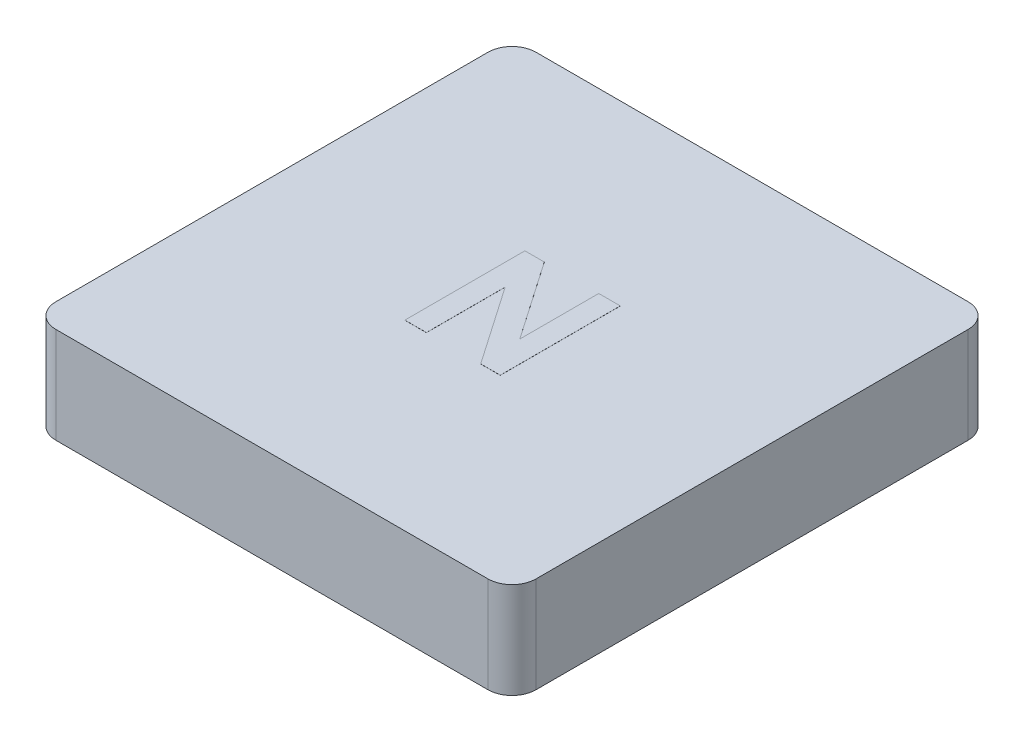
ISO-10303-21;
HEADER;
FILE_DESCRIPTION(('STEP AP214'),'2;1');
FILE_NAME('part.step','',(''),(''),'','','');
FILE_SCHEMA(('AUTOMOTIVE_DESIGN { 1 0 10303 214 1 1 1 1 }'));
ENDSEC;
DATA;
#1=APPLICATION_CONTEXT('core data for automotive mechanical design processes');
#2=APPLICATION_PROTOCOL_DEFINITION('international standard','automotive_design',2000,#1);
#3=PRODUCT_CONTEXT('',#1,'mechanical');
#4=PRODUCT('Part','Part','',(#3));
#5=PRODUCT_RELATED_PRODUCT_CATEGORY('part','',(#4));
#6=PRODUCT_DEFINITION_FORMATION('','',#4);
#7=PRODUCT_DEFINITION_CONTEXT('part definition',#1,'design');
#8=PRODUCT_DEFINITION('design','',#6,#7);
#9=PRODUCT_DEFINITION_SHAPE('','',#8);
#10=(LENGTH_UNIT() NAMED_UNIT(*) SI_UNIT(.MILLI.,.METRE.));
#11=(NAMED_UNIT(*) PLANE_ANGLE_UNIT() SI_UNIT($,.RADIAN.));
#12=(NAMED_UNIT(*) SI_UNIT($,.STERADIAN.) SOLID_ANGLE_UNIT());
#13=UNCERTAINTY_MEASURE_WITH_UNIT(LENGTH_MEASURE(1.E-05),#10,'distance_accuracy_value','');
#14=(GEOMETRIC_REPRESENTATION_CONTEXT(3) GLOBAL_UNCERTAINTY_ASSIGNED_CONTEXT((#13)) GLOBAL_UNIT_ASSIGNED_CONTEXT((#10,
#11,#12)) REPRESENTATION_CONTEXT('',''));
#15=CARTESIAN_POINT('',(0.,0.,0.));
#16=DIRECTION('',(0.,0.,1.));
#17=DIRECTION('',(1.,0.,0.));
#18=AXIS2_PLACEMENT_3D('',#15,#16,#17);
#19=CARTESIAN_POINT('',(0.,2.54,-12.7));
#20=DIRECTION('',(1.,0.,0.));
#21=DIRECTION('',(0.,0.,-1.));
#22=AXIS2_PLACEMENT_3D('',#19,#20,#21);
#23=PLANE('',#22);
#24=DIRECTION('',(0.,0.,1.));
#25=VECTOR('',#24,1.);
#26=CARTESIAN_POINT('',(0.,2.54,-12.7));
#27=LINE('',#26,#25);
#28=CARTESIAN_POINT('',(0.,2.54,-12.065));
#29=VERTEX_POINT('',#28);
#30=CARTESIAN_POINT('',(0.,2.54,-0.635));
#31=VERTEX_POINT('',#30);
#32=EDGE_CURVE('E308',#29,#31,#27,.T.);
#33=ORIENTED_EDGE('',*,*,#32,.F.);
#34=DIRECTION('',(0.,-1.,0.));
#35=VECTOR('',#34,1.);
#36=CARTESIAN_POINT('',(0.,2.54,-12.065));
#37=LINE('',#36,#35);
#38=CARTESIAN_POINT('',(0.,0.,-12.065));
#39=VERTEX_POINT('',#38);
#40=EDGE_CURVE('E333',#29,#39,#37,.T.);
#41=ORIENTED_EDGE('',*,*,#40,.T.);
#42=DIRECTION('',(0.,0.,1.));
#43=VECTOR('',#42,1.);
#44=CARTESIAN_POINT('',(0.,0.,-12.7));
#45=LINE('',#44,#43);
#46=CARTESIAN_POINT('',(0.,0.,-0.635));
#47=VERTEX_POINT('',#46);
#48=EDGE_CURVE('E288',#39,#47,#45,.T.);
#49=ORIENTED_EDGE('',*,*,#48,.T.);
#50=DIRECTION('',(0.,-1.,0.));
#51=VECTOR('',#50,1.);
#52=CARTESIAN_POINT('',(0.,2.54,-0.635));
#53=LINE('',#52,#51);
#54=EDGE_CURVE('E321',#47,#31,#53,.F.);
#55=ORIENTED_EDGE('',*,*,#54,.T.);
#56=EDGE_LOOP('',(#33,#41,#49,#55));
#57=FACE_BOUND('',#56,.T.);
#58=ADVANCED_FACE('F33',(#57),#23,.F.);
#59=CARTESIAN_POINT('',(0.,2.54,0.));
#60=DIRECTION('',(0.,0.,-1.));
#61=DIRECTION('',(-1.,0.,0.));
#62=AXIS2_PLACEMENT_3D('',#59,#60,#61);
#63=PLANE('',#62);
#64=DIRECTION('',(1.,0.,0.));
#65=VECTOR('',#64,1.);
#66=CARTESIAN_POINT('',(0.,0.,0.));
#67=LINE('',#66,#65);
#68=CARTESIAN_POINT('',(0.635,0.,0.));
#69=VERTEX_POINT('',#68);
#70=CARTESIAN_POINT('',(12.065,0.,0.));
#71=VERTEX_POINT('',#70);
#72=EDGE_CURVE('E324',#69,#71,#67,.T.);
#73=ORIENTED_EDGE('',*,*,#72,.T.);
#74=DIRECTION('',(0.,-1.,0.));
#75=VECTOR('',#74,1.);
#76=CARTESIAN_POINT('',(12.065,2.54,0.));
#77=LINE('',#76,#75);
#78=CARTESIAN_POINT('',(12.065,2.54,0.));
#79=VERTEX_POINT('',#78);
#80=EDGE_CURVE('E41',#71,#79,#77,.F.);
#81=ORIENTED_EDGE('',*,*,#80,.T.);
#82=DIRECTION('',(1.,0.,0.));
#83=VECTOR('',#82,1.);
#84=CARTESIAN_POINT('',(0.,2.54,0.));
#85=LINE('',#84,#83);
#86=CARTESIAN_POINT('',(0.635,2.54,0.));
#87=VERTEX_POINT('',#86);
#88=EDGE_CURVE('E311',#87,#79,#85,.T.);
#89=ORIENTED_EDGE('',*,*,#88,.F.);
#90=DIRECTION('',(0.,-1.,0.));
#91=VECTOR('',#90,1.);
#92=CARTESIAN_POINT('',(0.635,2.54,0.));
#93=LINE('',#92,#91);
#94=EDGE_CURVE('E362',#87,#69,#93,.T.);
#95=ORIENTED_EDGE('',*,*,#94,.T.);
#96=EDGE_LOOP('',(#73,#81,#89,#95));
#97=FACE_BOUND('',#96,.T.);
#98=ADVANCED_FACE('F367',(#97),#63,.F.);
#99=CARTESIAN_POINT('',(12.7,2.54,0.));
#100=DIRECTION('',(-1.,0.,0.));
#101=DIRECTION('',(0.,0.,1.));
#102=AXIS2_PLACEMENT_3D('',#99,#100,#101);
#103=PLANE('',#102);
#104=DIRECTION('',(0.,0.,-1.));
#105=VECTOR('',#104,1.);
#106=CARTESIAN_POINT('',(12.7,0.,0.));
#107=LINE('',#106,#105);
#108=CARTESIAN_POINT('',(12.7,0.,-0.635));
#109=VERTEX_POINT('',#108);
#110=CARTESIAN_POINT('',(12.7,0.,-12.065));
#111=VERTEX_POINT('',#110);
#112=EDGE_CURVE('E327',#109,#111,#107,.T.);
#113=ORIENTED_EDGE('',*,*,#112,.T.);
#114=DIRECTION('',(0.,-1.,0.));
#115=VECTOR('',#114,1.);
#116=CARTESIAN_POINT('',(12.7,2.54,-12.065));
#117=LINE('',#116,#115);
#118=CARTESIAN_POINT('',(12.7,2.54,-12.065));
#119=VERTEX_POINT('',#118);
#120=EDGE_CURVE('E360',#111,#119,#117,.F.);
#121=ORIENTED_EDGE('',*,*,#120,.T.);
#122=DIRECTION('',(0.,0.,-1.));
#123=VECTOR('',#122,1.);
#124=CARTESIAN_POINT('',(12.7,2.54,0.));
#125=LINE('',#124,#123);
#126=CARTESIAN_POINT('',(12.7,2.54,-0.635));
#127=VERTEX_POINT('',#126);
#128=EDGE_CURVE('E315',#127,#119,#125,.T.);
#129=ORIENTED_EDGE('',*,*,#128,.F.);
#130=DIRECTION('',(0.,-1.,0.));
#131=VECTOR('',#130,1.);
#132=CARTESIAN_POINT('',(12.7,2.54,-0.635));
#133=LINE('',#132,#131);
#134=EDGE_CURVE('E357',#127,#109,#133,.T.);
#135=ORIENTED_EDGE('',*,*,#134,.T.);
#136=EDGE_LOOP('',(#113,#121,#129,#135));
#137=FACE_BOUND('',#136,.T.);
#138=ADVANCED_FACE('F380',(#137),#103,.F.);
#139=CARTESIAN_POINT('',(12.7,2.54,-12.7));
#140=DIRECTION('',(0.,0.,1.));
#141=DIRECTION('',(1.,0.,0.));
#142=AXIS2_PLACEMENT_3D('',#139,#140,#141);
#143=PLANE('',#142);
#144=DIRECTION('',(-1.,0.,0.));
#145=VECTOR('',#144,1.);
#146=CARTESIAN_POINT('',(12.7,0.,-12.7));
#147=LINE('',#146,#145);
#148=CARTESIAN_POINT('',(12.065,0.,-12.7));
#149=VERTEX_POINT('',#148);
#150=CARTESIAN_POINT('',(0.634999999999995,0.,-12.7));
#151=VERTEX_POINT('',#150);
#152=EDGE_CURVE('E312',#149,#151,#147,.T.);
#153=ORIENTED_EDGE('',*,*,#152,.T.);
#154=DIRECTION('',(0.,-1.,0.));
#155=VECTOR('',#154,1.);
#156=CARTESIAN_POINT('',(0.634999999999995,2.54,-12.7));
#157=LINE('',#156,#155);
#158=CARTESIAN_POINT('',(0.634999999999995,2.54,-12.7));
#159=VERTEX_POINT('',#158);
#160=EDGE_CURVE('E347',#151,#159,#157,.F.);
#161=ORIENTED_EDGE('',*,*,#160,.T.);
#162=DIRECTION('',(-1.,0.,0.));
#163=VECTOR('',#162,1.);
#164=CARTESIAN_POINT('',(12.7,2.54,-12.7));
#165=LINE('',#164,#163);
#166=CARTESIAN_POINT('',(12.065,2.54,-12.7));
#167=VERTEX_POINT('',#166);
#168=EDGE_CURVE('E318',#167,#159,#165,.T.);
#169=ORIENTED_EDGE('',*,*,#168,.F.);
#170=DIRECTION('',(0.,-1.,0.));
#171=VECTOR('',#170,1.);
#172=CARTESIAN_POINT('',(12.065,2.54,-12.7));
#173=LINE('',#172,#171);
#174=EDGE_CURVE('E344',#167,#149,#173,.T.);
#175=ORIENTED_EDGE('',*,*,#174,.T.);
#176=EDGE_LOOP('',(#153,#161,#169,#175));
#177=FACE_BOUND('',#176,.T.);
#178=ADVANCED_FACE('F392',(#177),#143,.F.);
#179=CARTESIAN_POINT('',(0.,2.54,0.));
#180=DIRECTION('',(0.,1.,0.));
#181=DIRECTION('',(0.,0.,1.));
#182=AXIS2_PLACEMENT_3D('',#179,#180,#181);
#183=PLANE('',#182);
#184=DIRECTION('',(0.,0.,-1.));
#185=VECTOR('',#184,1.);
#186=CARTESIAN_POINT('',(5.03994615384615,2.54,-4.826));
#187=LINE('',#186,#185);
#188=CARTESIAN_POINT('',(5.03994615384615,2.54,-4.826));
#189=VERTEX_POINT('',#188);
#190=CARTESIAN_POINT('',(5.03994615384615,2.54,-8.001));
#191=VERTEX_POINT('',#190);
#192=EDGE_CURVE('E230',#189,#191,#187,.T.);
#193=ORIENTED_EDGE('',*,*,#192,.T.);
#194=DIRECTION('',(1.,0.,0.));
#195=VECTOR('',#194,1.);
#196=CARTESIAN_POINT('',(5.03994615384615,2.54,-8.001));
#197=LINE('',#196,#195);
#198=CARTESIAN_POINT('',(5.55321237980769,2.54,-8.001));
#199=VERTEX_POINT('',#198);
#200=EDGE_CURVE('E187',#191,#199,#197,.T.);
#201=ORIENTED_EDGE('',*,*,#200,.T.);
#202=DIRECTION('',(0.567645105726481,0.,0.823273365258935));
#203=VECTOR('',#202,1.);
#204=CARTESIAN_POINT('',(5.55321237980769,2.54,-8.001));
#205=LINE('',#204,#203);
#206=CARTESIAN_POINT('',(6.9937923076923,2.54,-5.91168209134615));
#207=VERTEX_POINT('',#206);
#208=EDGE_CURVE('E233',#199,#207,#205,.T.);
#209=ORIENTED_EDGE('',*,*,#208,.T.);
#210=DIRECTION('',(0.,0.,-1.));
#211=VECTOR('',#210,1.);
#212=CARTESIAN_POINT('',(6.9937923076923,2.54,-5.91168209134615));
#213=LINE('',#212,#211);
#214=CARTESIAN_POINT('',(6.9937923076923,2.54,-8.001));
#215=VERTEX_POINT('',#214);
#216=EDGE_CURVE('E235',#207,#215,#213,.T.);
#217=ORIENTED_EDGE('',*,*,#216,.T.);
#218=DIRECTION('',(1.,0.,0.));
#219=VECTOR('',#218,1.);
#220=CARTESIAN_POINT('',(6.9937923076923,2.54,-8.001));
#221=LINE('',#220,#219);
#222=CARTESIAN_POINT('',(7.5636641025641,2.54,-8.001));
#223=VERTEX_POINT('',#222);
#224=EDGE_CURVE('E237',#215,#223,#221,.T.);
#225=ORIENTED_EDGE('',*,*,#224,.T.);
#226=DIRECTION('',(0.,0.,1.));
#227=VECTOR('',#226,1.);
#228=CARTESIAN_POINT('',(7.5636641025641,2.54,-8.001));
#229=LINE('',#228,#227);
#230=CARTESIAN_POINT('',(7.5636641025641,2.54,-4.826));
#231=VERTEX_POINT('',#230);
#232=EDGE_CURVE('E239',#223,#231,#229,.T.);
#233=ORIENTED_EDGE('',*,*,#232,.T.);
#234=DIRECTION('',(-1.,0.,0.));
#235=VECTOR('',#234,1.);
#236=CARTESIAN_POINT('',(7.5636641025641,2.54,-4.826));
#237=LINE('',#236,#235);
#238=CARTESIAN_POINT('',(7.04658177083333,2.54,-4.826));
#239=VERTEX_POINT('',#238);
#240=EDGE_CURVE('E241',#231,#239,#237,.T.);
#241=ORIENTED_EDGE('',*,*,#240,.T.);
#242=DIRECTION('',(-0.567797563527585,0.,-0.823168225122993));
#243=VECTOR('',#242,1.);
#244=CARTESIAN_POINT('',(7.04658177083333,2.54,-4.826));
#245=LINE('',#244,#243);
#246=CARTESIAN_POINT('',(5.60981794871794,2.54,-6.90895773237179));
#247=VERTEX_POINT('',#246);
#248=EDGE_CURVE('E243',#239,#247,#245,.T.);
#249=ORIENTED_EDGE('',*,*,#248,.T.);
#250=DIRECTION('',(0.,0.,1.));
#251=VECTOR('',#250,1.);
#252=CARTESIAN_POINT('',(5.60981794871794,2.54,-6.90895773237179));
#253=LINE('',#252,#251);
#254=CARTESIAN_POINT('',(5.60981794871794,2.54,-4.826));
#255=VERTEX_POINT('',#254);
#256=EDGE_CURVE('E53',#247,#255,#253,.T.);
#257=ORIENTED_EDGE('',*,*,#256,.T.);
#258=DIRECTION('',(-1.,0.,0.));
#259=VECTOR('',#258,1.);
#260=CARTESIAN_POINT('',(5.60981794871794,2.54,-4.826));
#261=LINE('',#260,#259);
#262=EDGE_CURVE('E48',#255,#189,#261,.T.);
#263=ORIENTED_EDGE('',*,*,#262,.T.);
#264=EDGE_LOOP('',(#193,#201,#209,#217,#225,#233,#241,#249,#257,#263));
#265=FACE_BOUND('',#264,.T.);
#266=ORIENTED_EDGE('',*,*,#168,.T.);
#267=CARTESIAN_POINT('',(0.634999999999995,2.54,-12.065));
#268=DIRECTION('',(0.,1.,0.));
#269=DIRECTION('',(0.,0.,1.));
#270=AXIS2_PLACEMENT_3D('',#267,#268,#269);
#271=CIRCLE('',#270,0.635);
#272=EDGE_CURVE('E355',#159,#29,#271,.T.);
#273=ORIENTED_EDGE('',*,*,#272,.T.);
#274=ORIENTED_EDGE('',*,*,#32,.T.);
#275=CARTESIAN_POINT('',(0.635,2.54,-0.635));
#276=DIRECTION('',(0.,1.,0.));
#277=DIRECTION('',(0.,0.,1.));
#278=AXIS2_PLACEMENT_3D('',#275,#276,#277);
#279=CIRCLE('',#278,0.635);
#280=EDGE_CURVE('E349',#31,#87,#279,.T.);
#281=ORIENTED_EDGE('',*,*,#280,.T.);
#282=ORIENTED_EDGE('',*,*,#88,.T.);
#283=CARTESIAN_POINT('',(12.065,2.54,-0.635));
#284=DIRECTION('',(0.,1.,0.));
#285=DIRECTION('',(0.,0.,1.));
#286=AXIS2_PLACEMENT_3D('',#283,#284,#285);
#287=CIRCLE('',#286,0.635);
#288=EDGE_CURVE('E351',#79,#127,#287,.T.);
#289=ORIENTED_EDGE('',*,*,#288,.T.);
#290=ORIENTED_EDGE('',*,*,#128,.T.);
#291=CARTESIAN_POINT('',(12.065,2.54,-12.065));
#292=DIRECTION('',(0.,1.,0.));
#293=DIRECTION('',(0.,0.,1.));
#294=AXIS2_PLACEMENT_3D('',#291,#292,#293);
#295=CIRCLE('',#294,0.635);
#296=EDGE_CURVE('E353',#119,#167,#295,.T.);
#297=ORIENTED_EDGE('',*,*,#296,.T.);
#298=EDGE_LOOP('',(#266,#273,#274,#281,#282,#289,#290,#297));
#299=FACE_BOUND('',#298,.T.);
#300=ADVANCED_FACE('F373',(#265,#299),#183,.T.);
#301=CARTESIAN_POINT('',(0.,0.,0.));
#302=DIRECTION('',(0.,1.,0.));
#303=DIRECTION('',(0.,0.,1.));
#304=AXIS2_PLACEMENT_3D('',#301,#302,#303);
#305=PLANE('',#304);
#306=DIRECTION('',(-1.,0.,0.));
#307=VECTOR('',#306,1.);
#308=CARTESIAN_POINT('',(12.7,0.,-12.065));
#309=LINE('',#308,#307);
#310=CARTESIAN_POINT('',(12.065,0.,-12.065));
#311=VERTEX_POINT('',#310);
#312=CARTESIAN_POINT('',(0.634999999999995,0.,-12.065));
#313=VERTEX_POINT('',#312);
#314=EDGE_CURVE('E276',#311,#313,#309,.T.);
#315=ORIENTED_EDGE('',*,*,#314,.T.);
#316=DIRECTION('',(0.,0.,1.));
#317=VECTOR('',#316,1.);
#318=CARTESIAN_POINT('',(0.634999999999995,0.,-12.7));
#319=LINE('',#318,#317);
#320=CARTESIAN_POINT('',(0.635,0.,-0.635));
#321=VERTEX_POINT('',#320);
#322=EDGE_CURVE('E271',#313,#321,#319,.T.);
#323=ORIENTED_EDGE('',*,*,#322,.T.);
#324=DIRECTION('',(1.,0.,0.));
#325=VECTOR('',#324,1.);
#326=CARTESIAN_POINT('',(0.,0.,-0.635));
#327=LINE('',#326,#325);
#328=CARTESIAN_POINT('',(12.065,0.,-0.635));
#329=VERTEX_POINT('',#328);
#330=EDGE_CURVE('E300',#321,#329,#327,.T.);
#331=ORIENTED_EDGE('',*,*,#330,.T.);
#332=DIRECTION('',(0.,0.,-1.));
#333=VECTOR('',#332,1.);
#334=CARTESIAN_POINT('',(12.065,0.,0.));
#335=LINE('',#334,#333);
#336=EDGE_CURVE('E303',#329,#311,#335,.T.);
#337=ORIENTED_EDGE('',*,*,#336,.T.);
#338=EDGE_LOOP('',(#315,#323,#331,#337));
#339=FACE_BOUND('',#338,.T.);
#340=ORIENTED_EDGE('',*,*,#48,.F.);
#341=CARTESIAN_POINT('',(0.634999999999995,0.,-12.065));
#342=DIRECTION('',(0.,1.,0.));
#343=DIRECTION('',(0.,0.,1.));
#344=AXIS2_PLACEMENT_3D('',#341,#342,#343);
#345=CIRCLE('',#344,0.635);
#346=EDGE_CURVE('E342',#39,#151,#345,.F.);
#347=ORIENTED_EDGE('',*,*,#346,.T.);
#348=ORIENTED_EDGE('',*,*,#152,.F.);
#349=CARTESIAN_POINT('',(12.065,0.,-12.065));
#350=DIRECTION('',(0.,1.,0.));
#351=DIRECTION('',(0.,0.,1.));
#352=AXIS2_PLACEMENT_3D('',#349,#350,#351);
#353=CIRCLE('',#352,0.635);
#354=EDGE_CURVE('E340',#149,#111,#353,.F.);
#355=ORIENTED_EDGE('',*,*,#354,.T.);
#356=ORIENTED_EDGE('',*,*,#112,.F.);
#357=CARTESIAN_POINT('',(12.065,0.,-0.635));
#358=DIRECTION('',(0.,1.,0.));
#359=DIRECTION('',(0.,0.,1.));
#360=AXIS2_PLACEMENT_3D('',#357,#358,#359);
#361=CIRCLE('',#360,0.635);
#362=EDGE_CURVE('E338',#109,#71,#361,.F.);
#363=ORIENTED_EDGE('',*,*,#362,.T.);
#364=ORIENTED_EDGE('',*,*,#72,.F.);
#365=CARTESIAN_POINT('',(0.635,0.,-0.635));
#366=DIRECTION('',(0.,1.,0.));
#367=DIRECTION('',(0.,0.,1.));
#368=AXIS2_PLACEMENT_3D('',#365,#366,#367);
#369=CIRCLE('',#368,0.635);
#370=EDGE_CURVE('E336',#69,#47,#369,.F.);
#371=ORIENTED_EDGE('',*,*,#370,.T.);
#372=EDGE_LOOP('',(#340,#347,#348,#355,#356,#363,#364,#371));
#373=FACE_BOUND('',#372,.T.);
#374=ADVANCED_FACE('F384',(#339,#373),#305,.F.);
#375=CARTESIAN_POINT('',(0.634999999999995,2.54,-12.065));
#376=DIRECTION('',(0.,-1.,0.));
#377=DIRECTION('',(0.,0.,-1.));
#378=AXIS2_PLACEMENT_3D('',#375,#376,#377);
#379=CYLINDRICAL_SURFACE('',#378,0.635);
#380=ORIENTED_EDGE('',*,*,#272,.F.);
#381=ORIENTED_EDGE('',*,*,#160,.F.);
#382=ORIENTED_EDGE('',*,*,#346,.F.);
#383=ORIENTED_EDGE('',*,*,#40,.F.);
#384=EDGE_LOOP('',(#380,#381,#382,#383));
#385=FACE_BOUND('',#384,.T.);
#386=ADVANCED_FACE('F398',(#385),#379,.T.);
#387=CARTESIAN_POINT('',(12.065,2.54,-12.065));
#388=DIRECTION('',(0.,-1.,0.));
#389=DIRECTION('',(0.,0.,-1.));
#390=AXIS2_PLACEMENT_3D('',#387,#388,#389);
#391=CYLINDRICAL_SURFACE('',#390,0.635);
#392=ORIENTED_EDGE('',*,*,#296,.F.);
#393=ORIENTED_EDGE('',*,*,#120,.F.);
#394=ORIENTED_EDGE('',*,*,#354,.F.);
#395=ORIENTED_EDGE('',*,*,#174,.F.);
#396=EDGE_LOOP('',(#392,#393,#394,#395));
#397=FACE_BOUND('',#396,.T.);
#398=ADVANCED_FACE('F389',(#397),#391,.T.);
#399=CARTESIAN_POINT('',(12.065,2.54,-0.635));
#400=DIRECTION('',(0.,-1.,0.));
#401=DIRECTION('',(0.,0.,-1.));
#402=AXIS2_PLACEMENT_3D('',#399,#400,#401);
#403=CYLINDRICAL_SURFACE('',#402,0.635);
#404=ORIENTED_EDGE('',*,*,#288,.F.);
#405=ORIENTED_EDGE('',*,*,#80,.F.);
#406=ORIENTED_EDGE('',*,*,#362,.F.);
#407=ORIENTED_EDGE('',*,*,#134,.F.);
#408=EDGE_LOOP('',(#404,#405,#406,#407));
#409=FACE_BOUND('',#408,.T.);
#410=ADVANCED_FACE('F377',(#409),#403,.T.);
#411=CARTESIAN_POINT('',(0.635,2.54,-0.635));
#412=DIRECTION('',(0.,-1.,0.));
#413=DIRECTION('',(0.,0.,-1.));
#414=AXIS2_PLACEMENT_3D('',#411,#412,#413);
#415=CYLINDRICAL_SURFACE('',#414,0.635);
#416=ORIENTED_EDGE('',*,*,#280,.F.);
#417=ORIENTED_EDGE('',*,*,#54,.F.);
#418=ORIENTED_EDGE('',*,*,#370,.F.);
#419=ORIENTED_EDGE('',*,*,#94,.F.);
#420=EDGE_LOOP('',(#416,#417,#418,#419));
#421=FACE_BOUND('',#420,.T.);
#422=ADVANCED_FACE('F35',(#421),#415,.T.);
#423=CARTESIAN_POINT('',(0.634999999999995,2.54,-12.7));
#424=DIRECTION('',(1.,0.,0.));
#425=DIRECTION('',(0.,0.,-1.));
#426=AXIS2_PLACEMENT_3D('',#423,#424,#425);
#427=PLANE('',#426);
#428=DIRECTION('',(0.,0.,1.));
#429=VECTOR('',#428,1.);
#430=CARTESIAN_POINT('',(0.634999999999995,1.905,-12.7));
#431=LINE('',#430,#429);
#432=CARTESIAN_POINT('',(0.634999999999995,1.905,-12.065));
#433=VERTEX_POINT('',#432);
#434=CARTESIAN_POINT('',(0.635,1.905,-0.635));
#435=VERTEX_POINT('',#434);
#436=EDGE_CURVE('E272',#433,#435,#431,.T.);
#437=ORIENTED_EDGE('',*,*,#436,.T.);
#438=DIRECTION('',(0.,1.,0.));
#439=VECTOR('',#438,1.);
#440=CARTESIAN_POINT('',(0.635,2.54,-0.635));
#441=LINE('',#440,#439);
#442=EDGE_CURVE('E281',#321,#435,#441,.T.);
#443=ORIENTED_EDGE('',*,*,#442,.F.);
#444=ORIENTED_EDGE('',*,*,#322,.F.);
#445=DIRECTION('',(0.,1.,0.));
#446=VECTOR('',#445,1.);
#447=CARTESIAN_POINT('',(0.634999999999995,2.54,-12.065));
#448=LINE('',#447,#446);
#449=EDGE_CURVE('E277',#313,#433,#448,.T.);
#450=ORIENTED_EDGE('',*,*,#449,.T.);
#451=EDGE_LOOP('',(#437,#443,#444,#450));
#452=FACE_BOUND('',#451,.T.);
#453=ADVANCED_FACE('F403',(#452),#427,.T.);
#454=CARTESIAN_POINT('',(0.,2.54,-0.635));
#455=DIRECTION('',(0.,0.,-1.));
#456=DIRECTION('',(-1.,0.,0.));
#457=AXIS2_PLACEMENT_3D('',#454,#455,#456);
#458=PLANE('',#457);
#459=ORIENTED_EDGE('',*,*,#330,.F.);
#460=ORIENTED_EDGE('',*,*,#442,.T.);
#461=DIRECTION('',(1.,0.,0.));
#462=VECTOR('',#461,1.);
#463=CARTESIAN_POINT('',(0.,1.905,-0.635));
#464=LINE('',#463,#462);
#465=CARTESIAN_POINT('',(12.065,1.905,-0.635));
#466=VERTEX_POINT('',#465);
#467=EDGE_CURVE('E275',#435,#466,#464,.T.);
#468=ORIENTED_EDGE('',*,*,#467,.T.);
#469=DIRECTION('',(0.,1.,0.));
#470=VECTOR('',#469,1.);
#471=CARTESIAN_POINT('',(12.065,2.54,-0.635));
#472=LINE('',#471,#470);
#473=EDGE_CURVE('E285',#329,#466,#472,.T.);
#474=ORIENTED_EDGE('',*,*,#473,.F.);
#475=EDGE_LOOP('',(#459,#460,#468,#474));
#476=FACE_BOUND('',#475,.T.);
#477=ADVANCED_FACE('F408',(#476),#458,.T.);
#478=CARTESIAN_POINT('',(12.065,2.54,0.));
#479=DIRECTION('',(-1.,0.,0.));
#480=DIRECTION('',(0.,0.,1.));
#481=AXIS2_PLACEMENT_3D('',#478,#479,#480);
#482=PLANE('',#481);
#483=ORIENTED_EDGE('',*,*,#336,.F.);
#484=ORIENTED_EDGE('',*,*,#473,.T.);
#485=DIRECTION('',(0.,0.,-1.));
#486=VECTOR('',#485,1.);
#487=CARTESIAN_POINT('',(12.065,1.905,0.));
#488=LINE('',#487,#486);
#489=CARTESIAN_POINT('',(12.065,1.905,-12.065));
#490=VERTEX_POINT('',#489);
#491=EDGE_CURVE('E291',#466,#490,#488,.T.);
#492=ORIENTED_EDGE('',*,*,#491,.T.);
#493=DIRECTION('',(0.,1.,0.));
#494=VECTOR('',#493,1.);
#495=CARTESIAN_POINT('',(12.065,2.54,-12.065));
#496=LINE('',#495,#494);
#497=EDGE_CURVE('E280',#311,#490,#496,.T.);
#498=ORIENTED_EDGE('',*,*,#497,.F.);
#499=EDGE_LOOP('',(#483,#484,#492,#498));
#500=FACE_BOUND('',#499,.T.);
#501=ADVANCED_FACE('F461',(#500),#482,.T.);
#502=CARTESIAN_POINT('',(12.7,2.54,-12.065));
#503=DIRECTION('',(0.,0.,1.));
#504=DIRECTION('',(1.,0.,0.));
#505=AXIS2_PLACEMENT_3D('',#502,#503,#504);
#506=PLANE('',#505);
#507=ORIENTED_EDGE('',*,*,#314,.F.);
#508=ORIENTED_EDGE('',*,*,#497,.T.);
#509=DIRECTION('',(-1.,0.,0.));
#510=VECTOR('',#509,1.);
#511=CARTESIAN_POINT('',(12.7,1.905,-12.065));
#512=LINE('',#511,#510);
#513=EDGE_CURVE('E284',#490,#433,#512,.T.);
#514=ORIENTED_EDGE('',*,*,#513,.T.);
#515=ORIENTED_EDGE('',*,*,#449,.F.);
#516=EDGE_LOOP('',(#507,#508,#514,#515));
#517=FACE_BOUND('',#516,.T.);
#518=ADVANCED_FACE('F471',(#517),#506,.T.);
#519=CARTESIAN_POINT('',(0.,1.905,0.));
#520=DIRECTION('',(0.,1.,0.));
#521=DIRECTION('',(0.,0.,1.));
#522=AXIS2_PLACEMENT_3D('',#519,#520,#521);
#523=PLANE('',#522);
#524=CARTESIAN_POINT('',(6.34999999999999,1.905,-6.35));
#525=DIRECTION('',(0.,1.,0.));
#526=DIRECTION('',(0.,0.,1.));
#527=AXIS2_PLACEMENT_3D('',#524,#525,#526);
#528=CIRCLE('',#527,2.54);
#529=CARTESIAN_POINT('',(6.34999999999999,1.905,-3.81));
#530=VERTEX_POINT('',#529);
#531=EDGE_CURVE('E11',#530,#530,#528,.F.);
#532=ORIENTED_EDGE('',*,*,#531,.F.);
#533=EDGE_LOOP('',(#532));
#534=FACE_BOUND('',#533,.T.);
#535=ORIENTED_EDGE('',*,*,#513,.F.);
#536=ORIENTED_EDGE('',*,*,#491,.F.);
#537=ORIENTED_EDGE('',*,*,#467,.F.);
#538=ORIENTED_EDGE('',*,*,#436,.F.);
#539=EDGE_LOOP('',(#535,#536,#537,#538));
#540=FACE_BOUND('',#539,.T.);
#541=ADVANCED_FACE('F481',(#534,#540),#523,.F.);
#542=CARTESIAN_POINT('',(6.34999999999999,-7.18420489685532,-6.35));
#543=DIRECTION('',(0.,1.,0.));
#544=DIRECTION('',(0.,0.,1.));
#545=AXIS2_PLACEMENT_3D('',#542,#543,#544);
#546=CYLINDRICAL_SURFACE('',#545,2.54);
#547=CARTESIAN_POINT('',(6.34999999999999,0.,-6.35));
#548=DIRECTION('',(0.,1.,0.));
#549=DIRECTION('',(0.,0.,1.));
#550=AXIS2_PLACEMENT_3D('',#547,#548,#549);
#551=CIRCLE('',#550,2.54);
#552=CARTESIAN_POINT('',(6.34999999999999,0.,-3.81));
#553=VERTEX_POINT('',#552);
#554=EDGE_CURVE('E247',#553,#553,#551,.T.);
#555=CARTESIAN_POINT('',(6.34999999999999,0.,-3.81));
#556=CARTESIAN_POINT('',(6.34999999999999,0.0198437499999991,-3.81));
#557=CARTESIAN_POINT('',(6.34999999999999,0.0396874999999989,-3.81));
#558=CARTESIAN_POINT('',(6.34999999999999,0.079374999999999,-3.81));
#559=CARTESIAN_POINT('',(6.34999999999999,0.0992187499999992,-3.81));
#560=CARTESIAN_POINT('',(6.34999999999999,0.138906249999999,-3.81));
#561=CARTESIAN_POINT('',(6.34999999999999,0.158749999999999,-3.81));
#562=CARTESIAN_POINT('',(6.34999999999999,0.198437499999999,-3.81));
#563=CARTESIAN_POINT('',(6.34999999999999,0.218281249999999,-3.81));
#564=CARTESIAN_POINT('',(6.34999999999999,0.25796875,-3.81));
#565=CARTESIAN_POINT('',(6.34999999999999,0.277812499999999,-3.81));
#566=CARTESIAN_POINT('',(6.34999999999999,0.317499999999999,-3.81));
#567=CARTESIAN_POINT('',(6.34999999999999,0.337343749999999,-3.81));
#568=CARTESIAN_POINT('',(6.34999999999999,0.377031249999999,-3.81));
#569=CARTESIAN_POINT('',(6.34999999999999,0.396874999999999,-3.81));
#570=CARTESIAN_POINT('',(6.34999999999999,0.436562499999999,-3.81));
#571=CARTESIAN_POINT('',(6.34999999999999,0.456406249999999,-3.81));
#572=CARTESIAN_POINT('',(6.34999999999999,0.496093749999999,-3.81));
#573=CARTESIAN_POINT('',(6.34999999999999,0.515937499999999,-3.81));
#574=CARTESIAN_POINT('',(6.34999999999999,0.555624999999999,-3.81));
#575=CARTESIAN_POINT('',(6.34999999999999,0.575468749999999,-3.81));
#576=CARTESIAN_POINT('',(6.34999999999999,0.615156249999999,-3.81));
#577=CARTESIAN_POINT('',(6.34999999999999,0.634999999999999,-3.81));
#578=CARTESIAN_POINT('',(6.34999999999999,0.674687499999998,-3.81));
#579=CARTESIAN_POINT('',(6.34999999999999,0.694531249999998,-3.81));
#580=CARTESIAN_POINT('',(6.34999999999999,0.734218749999998,-3.81));
#581=CARTESIAN_POINT('',(6.34999999999999,0.754062499999998,-3.81));
#582=CARTESIAN_POINT('',(6.34999999999999,0.793749999999998,-3.81));
#583=CARTESIAN_POINT('',(6.34999999999999,0.813593749999999,-3.81));
#584=CARTESIAN_POINT('',(6.34999999999999,0.853281249999999,-3.81));
#585=CARTESIAN_POINT('',(6.34999999999999,0.873124999999999,-3.81));
#586=CARTESIAN_POINT('',(6.34999999999999,0.912812499999999,-3.81));
#587=CARTESIAN_POINT('',(6.34999999999999,0.932656249999999,-3.81));
#588=CARTESIAN_POINT('',(6.34999999999999,0.972343749999998,-3.81));
#589=CARTESIAN_POINT('',(6.34999999999999,0.992187499999998,-3.81));
#590=CARTESIAN_POINT('',(6.34999999999999,1.031875,-3.81));
#591=CARTESIAN_POINT('',(6.34999999999999,1.05171875,-3.81));
#592=CARTESIAN_POINT('',(6.34999999999999,1.09140625,-3.81));
#593=CARTESIAN_POINT('',(6.34999999999999,1.11125,-3.81));
#594=CARTESIAN_POINT('',(6.34999999999999,1.1509375,-3.81));
#595=CARTESIAN_POINT('',(6.34999999999999,1.17078125,-3.81));
#596=CARTESIAN_POINT('',(6.34999999999999,1.21046875,-3.81));
#597=CARTESIAN_POINT('',(6.34999999999999,1.2303125,-3.81));
#598=CARTESIAN_POINT('',(6.34999999999999,1.27,-3.81));
#599=CARTESIAN_POINT('',(6.34999999999999,1.28984375,-3.81));
#600=CARTESIAN_POINT('',(6.34999999999999,1.32953125,-3.81));
#601=CARTESIAN_POINT('',(6.34999999999999,1.349375,-3.81));
#602=CARTESIAN_POINT('',(6.34999999999999,1.3890625,-3.81));
#603=CARTESIAN_POINT('',(6.34999999999999,1.40890625,-3.81));
#604=CARTESIAN_POINT('',(6.34999999999999,1.44859375,-3.81));
#605=CARTESIAN_POINT('',(6.34999999999999,1.4684375,-3.81));
#606=CARTESIAN_POINT('',(6.34999999999999,1.508125,-3.81));
#607=CARTESIAN_POINT('',(6.34999999999999,1.52796875,-3.81));
#608=CARTESIAN_POINT('',(6.34999999999999,1.56765625,-3.81));
#609=CARTESIAN_POINT('',(6.34999999999999,1.5875,-3.81));
#610=CARTESIAN_POINT('',(6.34999999999999,1.6271875,-3.81));
#611=CARTESIAN_POINT('',(6.34999999999999,1.64703125,-3.81));
#612=CARTESIAN_POINT('',(6.34999999999999,1.68671875,-3.81));
#613=CARTESIAN_POINT('',(6.34999999999999,1.7065625,-3.81));
#614=CARTESIAN_POINT('',(6.34999999999999,1.74625,-3.81));
#615=CARTESIAN_POINT('',(6.34999999999999,1.76609375,-3.81));
#616=CARTESIAN_POINT('',(6.34999999999999,1.80578125,-3.81));
#617=CARTESIAN_POINT('',(6.34999999999999,1.825625,-3.81));
#618=CARTESIAN_POINT('',(6.34999999999999,1.8653125,-3.81));
#619=CARTESIAN_POINT('',(6.34999999999999,1.88515625,-3.81));
#620=CARTESIAN_POINT('',(6.34999999999999,1.905,-3.81));
#621=B_SPLINE_CURVE_WITH_KNOTS('',3,(#555,#556,#557,#558,#559,#560,#561,#562,#563,#564,#565,
#566,#567,#568,#569,#570,#571,#572,#573,#574,#575,#576,#577,#578,#579,#580,#581,#582,#583,#584,
#585,#586,#587,#588,#589,#590,#591,#592,#593,#594,#595,#596,#597,#598,#599,#600,#601,#602,#603,
#604,#605,#606,#607,#608,#609,#610,#611,#612,#613,#614,#615,#616,#617,#618,#619,#620),
.UNSPECIFIED.,.F.,.F.,(4,2,2,2,2,2,2,2,2,2,2,2,2,2,2,2,2,2,2,2,2,2,2,2,2,2,2,2,2,2,2,2,4),(0.,
0.0595312499999997,0.1190625,0.17859375,0.238125,0.29765625,0.3571875,0.41671875,0.47625,
0.53578125,0.5953125,0.654843749999999,0.714374999999999,0.773906249999999,0.8334375,0.89296875,
0.952499999999999,1.01203125,1.0715625,1.13109375,1.190625,1.25015625,1.3096875,1.36921875,
1.42875,1.48828125,1.5478125,1.60734375,1.666875,1.72640625,1.7859375,1.84546875,1.905),.UNSPECIFIED.);
#622=EDGE_CURVE('BSEAM491',#553,#530,#621,.T.);
#623=ORIENTED_EDGE('',*,*,#554,.T.);
#624=ORIENTED_EDGE('',*,*,#531,.T.);
#625=ORIENTED_EDGE('',*,*,#622,.T.);
#626=ORIENTED_EDGE('',*,*,#622,.F.);
#627=EDGE_LOOP('',(#623,#625,#624,#626));
#628=FACE_BOUND('',#627,.T.);
#629=ADVANCED_FACE('F491',(#628),#546,.T.);
#630=CARTESIAN_POINT('',(0.,0.,0.));
#631=DIRECTION('',(0.,1.,0.));
#632=DIRECTION('',(0.,0.,1.));
#633=AXIS2_PLACEMENT_3D('',#630,#631,#632);
#634=PLANE('',#633);
#635=ORIENTED_EDGE('',*,*,#554,.F.);
#636=EDGE_LOOP('',(#635));
#637=FACE_BOUND('',#636,.T.);
#638=ADVANCED_FACE('F501',(#637),#634,.F.);
#639=CARTESIAN_POINT('',(5.03994615384615,2.54254,-4.826));
#640=DIRECTION('',(-1.,0.,0.));
#641=DIRECTION('',(0.,0.,1.));
#642=AXIS2_PLACEMENT_3D('',#639,#640,#641);
#643=PLANE('',#642);
#644=ORIENTED_EDGE('',*,*,#192,.F.);
#645=DIRECTION('',(0.,-1.,0.));
#646=VECTOR('',#645,1.);
#647=CARTESIAN_POINT('',(5.03994615384615,2.54254,-4.826));
#648=LINE('',#647,#646);
#649=CARTESIAN_POINT('',(5.03994615384615,2.54254,-4.826));
#650=VERTEX_POINT('',#649);
#651=EDGE_CURVE('E206',#650,#189,#648,.T.);
#652=ORIENTED_EDGE('',*,*,#651,.F.);
#653=DIRECTION('',(0.,0.,-1.));
#654=VECTOR('',#653,1.);
#655=CARTESIAN_POINT('',(5.03994615384615,2.54254,-4.826));
#656=LINE('',#655,#654);
#657=CARTESIAN_POINT('',(5.03994615384615,2.54254,-8.001));
#658=VERTEX_POINT('',#657);
#659=EDGE_CURVE('E199',#650,#658,#656,.T.);
#660=ORIENTED_EDGE('',*,*,#659,.T.);
#661=DIRECTION('',(0.,-1.,0.));
#662=VECTOR('',#661,1.);
#663=CARTESIAN_POINT('',(5.03994615384615,2.54254,-8.001));
#664=LINE('',#663,#662);
#665=EDGE_CURVE('E182',#658,#191,#664,.T.);
#666=ORIENTED_EDGE('',*,*,#665,.T.);
#667=EDGE_LOOP('',(#644,#652,#660,#666));
#668=FACE_BOUND('',#667,.T.);
#669=ADVANCED_FACE('F205',(#668),#643,.T.);
#670=CARTESIAN_POINT('',(5.60981794871794,2.54254,-4.826));
#671=DIRECTION('',(0.,0.,1.));
#672=DIRECTION('',(1.,0.,0.));
#673=AXIS2_PLACEMENT_3D('',#670,#671,#672);
#674=PLANE('',#673);
#675=ORIENTED_EDGE('',*,*,#262,.F.);
#676=DIRECTION('',(0.,-1.,0.));
#677=VECTOR('',#676,1.);
#678=CARTESIAN_POINT('',(5.60981794871794,2.54254,-4.826));
#679=LINE('',#678,#677);
#680=CARTESIAN_POINT('',(5.60981794871794,2.54254,-4.826));
#681=VERTEX_POINT('',#680);
#682=EDGE_CURVE('E248',#681,#255,#679,.T.);
#683=ORIENTED_EDGE('',*,*,#682,.F.);
#684=DIRECTION('',(-1.,0.,0.));
#685=VECTOR('',#684,1.);
#686=CARTESIAN_POINT('',(5.60981794871794,2.54254,-4.826));
#687=LINE('',#686,#685);
#688=EDGE_CURVE('E192',#681,#650,#687,.T.);
#689=ORIENTED_EDGE('',*,*,#688,.T.);
#690=ORIENTED_EDGE('',*,*,#651,.T.);
#691=EDGE_LOOP('',(#675,#683,#689,#690));
#692=FACE_BOUND('',#691,.T.);
#693=ADVANCED_FACE('F528',(#692),#674,.T.);
#694=CARTESIAN_POINT('',(5.60981794871794,2.54254,-6.90895773237179));
#695=DIRECTION('',(1.,0.,0.));
#696=DIRECTION('',(0.,0.,-1.));
#697=AXIS2_PLACEMENT_3D('',#694,#695,#696);
#698=PLANE('',#697);
#699=ORIENTED_EDGE('',*,*,#256,.F.);
#700=DIRECTION('',(0.,-1.,0.));
#701=VECTOR('',#700,1.);
#702=CARTESIAN_POINT('',(5.60981794871794,2.54254,-6.90895773237179));
#703=LINE('',#702,#701);
#704=CARTESIAN_POINT('',(5.60981794871794,2.54254,-6.90895773237179));
#705=VERTEX_POINT('',#704);
#706=EDGE_CURVE('E250',#705,#247,#703,.T.);
#707=ORIENTED_EDGE('',*,*,#706,.F.);
#708=DIRECTION('',(0.,0.,1.));
#709=VECTOR('',#708,1.);
#710=CARTESIAN_POINT('',(5.60981794871794,2.54254,-6.90895773237179));
#711=LINE('',#710,#709);
#712=EDGE_CURVE('E226',#705,#681,#711,.T.);
#713=ORIENTED_EDGE('',*,*,#712,.T.);
#714=ORIENTED_EDGE('',*,*,#682,.T.);
#715=EDGE_LOOP('',(#699,#707,#713,#714));
#716=FACE_BOUND('',#715,.T.);
#717=ADVANCED_FACE('F537',(#716),#698,.T.);
#718=CARTESIAN_POINT('',(7.04658177083333,2.54254,-4.826));
#719=DIRECTION('',(-0.823168225122993,0.,0.567797563527585));
#720=DIRECTION('',(0.567797563527585,0.,0.823168225122993));
#721=AXIS2_PLACEMENT_3D('',#718,#719,#720);
#722=PLANE('',#721);
#723=ORIENTED_EDGE('',*,*,#248,.F.);
#724=DIRECTION('',(0.,-1.,0.));
#725=VECTOR('',#724,1.);
#726=CARTESIAN_POINT('',(7.04658177083333,2.54254,-4.826));
#727=LINE('',#726,#725);
#728=CARTESIAN_POINT('',(7.04658177083333,2.54254,-4.826));
#729=VERTEX_POINT('',#728);
#730=EDGE_CURVE('E253',#729,#239,#727,.T.);
#731=ORIENTED_EDGE('',*,*,#730,.F.);
#732=DIRECTION('',(-0.567797563527585,0.,-0.823168225122993));
#733=VECTOR('',#732,1.);
#734=CARTESIAN_POINT('',(7.04658177083333,2.54254,-4.826));
#735=LINE('',#734,#733);
#736=EDGE_CURVE('E223',#729,#705,#735,.T.);
#737=ORIENTED_EDGE('',*,*,#736,.T.);
#738=ORIENTED_EDGE('',*,*,#706,.T.);
#739=EDGE_LOOP('',(#723,#731,#737,#738));
#740=FACE_BOUND('',#739,.T.);
#741=ADVANCED_FACE('F547',(#740),#722,.T.);
#742=CARTESIAN_POINT('',(7.5636641025641,2.54254,-4.826));
#743=DIRECTION('',(0.,0.,1.));
#744=DIRECTION('',(1.,0.,0.));
#745=AXIS2_PLACEMENT_3D('',#742,#743,#744);
#746=PLANE('',#745);
#747=ORIENTED_EDGE('',*,*,#240,.F.);
#748=DIRECTION('',(0.,-1.,0.));
#749=VECTOR('',#748,1.);
#750=CARTESIAN_POINT('',(7.5636641025641,2.54254,-4.826));
#751=LINE('',#750,#749);
#752=CARTESIAN_POINT('',(7.5636641025641,2.54254,-4.826));
#753=VERTEX_POINT('',#752);
#754=EDGE_CURVE('E256',#753,#231,#751,.T.);
#755=ORIENTED_EDGE('',*,*,#754,.F.);
#756=DIRECTION('',(-1.,0.,0.));
#757=VECTOR('',#756,1.);
#758=CARTESIAN_POINT('',(7.5636641025641,2.54254,-4.826));
#759=LINE('',#758,#757);
#760=EDGE_CURVE('E220',#753,#729,#759,.T.);
#761=ORIENTED_EDGE('',*,*,#760,.T.);
#762=ORIENTED_EDGE('',*,*,#730,.T.);
#763=EDGE_LOOP('',(#747,#755,#761,#762));
#764=FACE_BOUND('',#763,.T.);
#765=ADVANCED_FACE('F557',(#764),#746,.T.);
#766=CARTESIAN_POINT('',(7.5636641025641,2.54254,-8.001));
#767=DIRECTION('',(1.,0.,0.));
#768=DIRECTION('',(0.,0.,-1.));
#769=AXIS2_PLACEMENT_3D('',#766,#767,#768);
#770=PLANE('',#769);
#771=ORIENTED_EDGE('',*,*,#232,.F.);
#772=DIRECTION('',(0.,-1.,0.));
#773=VECTOR('',#772,1.);
#774=CARTESIAN_POINT('',(7.5636641025641,2.54254,-8.001));
#775=LINE('',#774,#773);
#776=CARTESIAN_POINT('',(7.5636641025641,2.54254,-8.001));
#777=VERTEX_POINT('',#776);
#778=EDGE_CURVE('E259',#777,#223,#775,.T.);
#779=ORIENTED_EDGE('',*,*,#778,.F.);
#780=DIRECTION('',(0.,0.,1.));
#781=VECTOR('',#780,1.);
#782=CARTESIAN_POINT('',(7.5636641025641,2.54254,-8.001));
#783=LINE('',#782,#781);
#784=EDGE_CURVE('E217',#777,#753,#783,.T.);
#785=ORIENTED_EDGE('',*,*,#784,.T.);
#786=ORIENTED_EDGE('',*,*,#754,.T.);
#787=EDGE_LOOP('',(#771,#779,#785,#786));
#788=FACE_BOUND('',#787,.T.);
#789=ADVANCED_FACE('F567',(#788),#770,.T.);
#790=CARTESIAN_POINT('',(6.9937923076923,2.54254,-8.001));
#791=DIRECTION('',(0.,0.,-1.));
#792=DIRECTION('',(-1.,0.,0.));
#793=AXIS2_PLACEMENT_3D('',#790,#791,#792);
#794=PLANE('',#793);
#795=ORIENTED_EDGE('',*,*,#224,.F.);
#796=DIRECTION('',(0.,-1.,0.));
#797=VECTOR('',#796,1.);
#798=CARTESIAN_POINT('',(6.9937923076923,2.54254,-8.001));
#799=LINE('',#798,#797);
#800=CARTESIAN_POINT('',(6.9937923076923,2.54254,-8.001));
#801=VERTEX_POINT('',#800);
#802=EDGE_CURVE('E262',#801,#215,#799,.T.);
#803=ORIENTED_EDGE('',*,*,#802,.F.);
#804=DIRECTION('',(1.,0.,0.));
#805=VECTOR('',#804,1.);
#806=CARTESIAN_POINT('',(6.9937923076923,2.54254,-8.001));
#807=LINE('',#806,#805);
#808=EDGE_CURVE('E214',#801,#777,#807,.T.);
#809=ORIENTED_EDGE('',*,*,#808,.T.);
#810=ORIENTED_EDGE('',*,*,#778,.T.);
#811=EDGE_LOOP('',(#795,#803,#809,#810));
#812=FACE_BOUND('',#811,.T.);
#813=ADVANCED_FACE('F577',(#812),#794,.T.);
#814=CARTESIAN_POINT('',(6.9937923076923,2.54254,-5.91168209134615));
#815=DIRECTION('',(-1.,0.,0.));
#816=DIRECTION('',(0.,0.,1.));
#817=AXIS2_PLACEMENT_3D('',#814,#815,#816);
#818=PLANE('',#817);
#819=ORIENTED_EDGE('',*,*,#216,.F.);
#820=DIRECTION('',(0.,-1.,0.));
#821=VECTOR('',#820,1.);
#822=CARTESIAN_POINT('',(6.9937923076923,2.54254,-5.91168209134615));
#823=LINE('',#822,#821);
#824=CARTESIAN_POINT('',(6.9937923076923,2.54254,-5.91168209134615));
#825=VERTEX_POINT('',#824);
#826=EDGE_CURVE('E265',#825,#207,#823,.T.);
#827=ORIENTED_EDGE('',*,*,#826,.F.);
#828=DIRECTION('',(0.,0.,-1.));
#829=VECTOR('',#828,1.);
#830=CARTESIAN_POINT('',(6.9937923076923,2.54254,-5.91168209134615));
#831=LINE('',#830,#829);
#832=EDGE_CURVE('E211',#825,#801,#831,.T.);
#833=ORIENTED_EDGE('',*,*,#832,.T.);
#834=ORIENTED_EDGE('',*,*,#802,.T.);
#835=EDGE_LOOP('',(#819,#827,#833,#834));
#836=FACE_BOUND('',#835,.T.);
#837=ADVANCED_FACE('F587',(#836),#818,.T.);
#838=CARTESIAN_POINT('',(5.55321237980769,2.54254,-8.001));
#839=DIRECTION('',(0.823273365258935,0.,-0.567645105726481));
#840=DIRECTION('',(-0.567645105726481,0.,-0.823273365258935));
#841=AXIS2_PLACEMENT_3D('',#838,#839,#840);
#842=PLANE('',#841);
#843=ORIENTED_EDGE('',*,*,#208,.F.);
#844=DIRECTION('',(0.,-1.,0.));
#845=VECTOR('',#844,1.);
#846=CARTESIAN_POINT('',(5.55321237980769,2.54254,-8.001));
#847=LINE('',#846,#845);
#848=CARTESIAN_POINT('',(5.55321237980769,2.54254,-8.001));
#849=VERTEX_POINT('',#848);
#850=EDGE_CURVE('E191',#849,#199,#847,.T.);
#851=ORIENTED_EDGE('',*,*,#850,.F.);
#852=DIRECTION('',(0.567645105726481,0.,0.823273365258935));
#853=VECTOR('',#852,1.);
#854=CARTESIAN_POINT('',(5.55321237980769,2.54254,-8.001));
#855=LINE('',#854,#853);
#856=EDGE_CURVE('E203',#849,#825,#855,.T.);
#857=ORIENTED_EDGE('',*,*,#856,.T.);
#858=ORIENTED_EDGE('',*,*,#826,.T.);
#859=EDGE_LOOP('',(#843,#851,#857,#858));
#860=FACE_BOUND('',#859,.T.);
#861=ADVANCED_FACE('F597',(#860),#842,.T.);
#862=CARTESIAN_POINT('',(5.03994615384615,2.54254,-8.001));
#863=DIRECTION('',(0.,0.,-1.));
#864=DIRECTION('',(-1.,0.,0.));
#865=AXIS2_PLACEMENT_3D('',#862,#863,#864);
#866=PLANE('',#865);
#867=ORIENTED_EDGE('',*,*,#200,.F.);
#868=ORIENTED_EDGE('',*,*,#665,.F.);
#869=DIRECTION('',(1.,0.,0.));
#870=VECTOR('',#869,1.);
#871=CARTESIAN_POINT('',(5.03994615384615,2.54254,-8.001));
#872=LINE('',#871,#870);
#873=EDGE_CURVE('E186',#658,#849,#872,.T.);
#874=ORIENTED_EDGE('',*,*,#873,.T.);
#875=ORIENTED_EDGE('',*,*,#850,.T.);
#876=EDGE_LOOP('',(#867,#868,#874,#875));
#877=FACE_BOUND('',#876,.T.);
#878=ADVANCED_FACE('F184',(#877),#866,.T.);
#879=CARTESIAN_POINT('',(0.,2.54254,0.));
#880=DIRECTION('',(0.,-1.,0.));
#881=DIRECTION('',(0.,0.,-1.));
#882=AXIS2_PLACEMENT_3D('',#879,#880,#881);
#883=PLANE('',#882);
#884=ORIENTED_EDGE('',*,*,#659,.F.);
#885=ORIENTED_EDGE('',*,*,#688,.F.);
#886=ORIENTED_EDGE('',*,*,#712,.F.);
#887=ORIENTED_EDGE('',*,*,#736,.F.);
#888=ORIENTED_EDGE('',*,*,#760,.F.);
#889=ORIENTED_EDGE('',*,*,#784,.F.);
#890=ORIENTED_EDGE('',*,*,#808,.F.);
#891=ORIENTED_EDGE('',*,*,#832,.F.);
#892=ORIENTED_EDGE('',*,*,#856,.F.);
#893=ORIENTED_EDGE('',*,*,#873,.F.);
#894=EDGE_LOOP('',(#884,#885,#886,#887,#888,#889,#890,#891,#892,#893));
#895=FACE_BOUND('',#894,.T.);
#896=ADVANCED_FACE('F197',(#895),#883,.F.);
#897=CLOSED_SHELL('',(#58,#98,#138,#178,#300,#374,#386,#398,#410,#422,#453,#477,#501,#518,#541,
#629,#638,#669,#693,#717,#741,#765,#789,#813,#837,#861,#878,#896));
#898=MANIFOLD_SOLID_BREP('B2',#897);
#899=ADVANCED_BREP_SHAPE_REPRESENTATION('',(#18,#898),#14);
#900=SHAPE_DEFINITION_REPRESENTATION(#9,#899);
ENDSEC;
END-ISO-10303-21;
